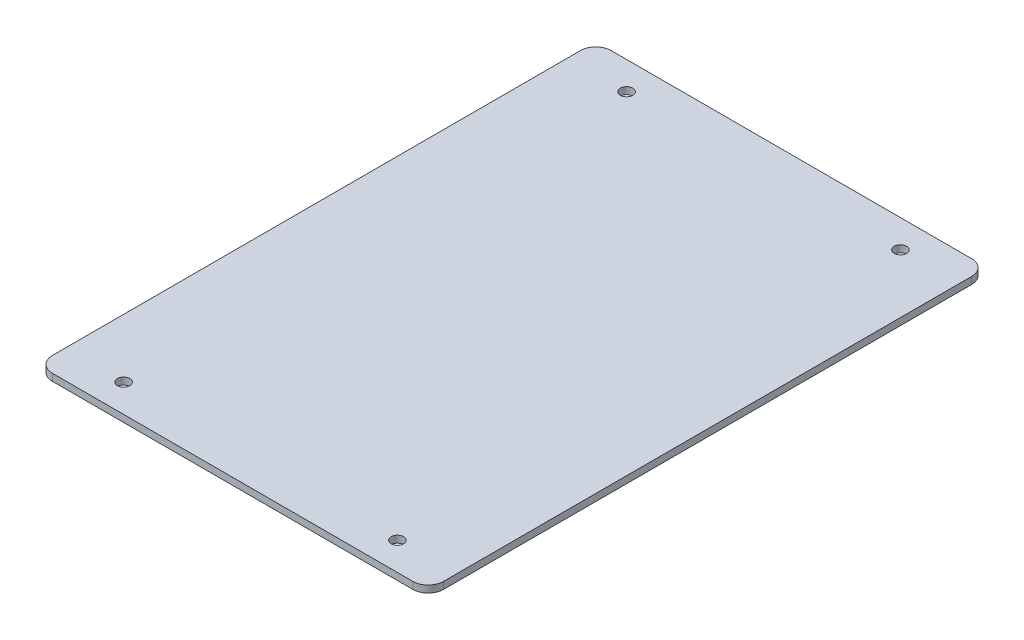
ISO-10303-21;
HEADER;
FILE_DESCRIPTION(('STEP AP214'),'2;1');
FILE_NAME('part.step','',(''),(''),'','','');
FILE_SCHEMA(('AUTOMOTIVE_DESIGN { 1 0 10303 214 1 1 1 1 }'));
ENDSEC;
DATA;
#1=APPLICATION_CONTEXT('core data for automotive mechanical design processes');
#2=APPLICATION_PROTOCOL_DEFINITION('international standard','automotive_design',2000,#1);
#3=PRODUCT_CONTEXT('',#1,'mechanical');
#4=PRODUCT('Part','Part','',(#3));
#5=PRODUCT_RELATED_PRODUCT_CATEGORY('part','',(#4));
#6=PRODUCT_DEFINITION_FORMATION('','',#4);
#7=PRODUCT_DEFINITION_CONTEXT('part definition',#1,'design');
#8=PRODUCT_DEFINITION('design','',#6,#7);
#9=PRODUCT_DEFINITION_SHAPE('','',#8);
#10=(LENGTH_UNIT() NAMED_UNIT(*) SI_UNIT(.MILLI.,.METRE.));
#11=(NAMED_UNIT(*) PLANE_ANGLE_UNIT() SI_UNIT($,.RADIAN.));
#12=(NAMED_UNIT(*) SI_UNIT($,.STERADIAN.) SOLID_ANGLE_UNIT());
#13=UNCERTAINTY_MEASURE_WITH_UNIT(LENGTH_MEASURE(1.E-05),#10,'distance_accuracy_value','');
#14=(GEOMETRIC_REPRESENTATION_CONTEXT(3) GLOBAL_UNCERTAINTY_ASSIGNED_CONTEXT((#13)) GLOBAL_UNIT_ASSIGNED_CONTEXT((#10,
#11,#12)) REPRESENTATION_CONTEXT('',''));
#15=CARTESIAN_POINT('',(0.,0.,0.));
#16=DIRECTION('',(0.,0.,1.));
#17=DIRECTION('',(1.,0.,0.));
#18=AXIS2_PLACEMENT_3D('',#15,#16,#17);
#19=CARTESIAN_POINT('',(35.56,1.27,50.8));
#20=DIRECTION('',(-1.,0.,0.));
#21=DIRECTION('',(0.,0.,1.));
#22=AXIS2_PLACEMENT_3D('',#19,#20,#21);
#23=PLANE('',#22);
#24=DIRECTION('',(0.,0.,-1.));
#25=VECTOR('',#24,1.);
#26=CARTESIAN_POINT('',(35.56,0.,50.8));
#27=LINE('',#26,#25);
#28=CARTESIAN_POINT('',(35.56,0.,48.006));
#29=VERTEX_POINT('',#28);
#30=CARTESIAN_POINT('',(35.56,0.,-48.006));
#31=VERTEX_POINT('',#30);
#32=EDGE_CURVE('E152',#29,#31,#27,.T.);
#33=ORIENTED_EDGE('',*,*,#32,.T.);
#34=DIRECTION('',(0.,-1.,0.));
#35=VECTOR('',#34,1.);
#36=CARTESIAN_POINT('',(35.56,1.27,-48.006));
#37=LINE('',#36,#35);
#38=CARTESIAN_POINT('',(35.56,1.27,-48.006));
#39=VERTEX_POINT('',#38);
#40=EDGE_CURVE('E127',#31,#39,#37,.F.);
#41=ORIENTED_EDGE('',*,*,#40,.T.);
#42=DIRECTION('',(0.,0.,-1.));
#43=VECTOR('',#42,1.);
#44=CARTESIAN_POINT('',(35.56,1.27,50.8));
#45=LINE('',#44,#43);
#46=CARTESIAN_POINT('',(35.56,1.27,48.006));
#47=VERTEX_POINT('',#46);
#48=EDGE_CURVE('E165',#47,#39,#45,.T.);
#49=ORIENTED_EDGE('',*,*,#48,.F.);
#50=DIRECTION('',(0.,-1.,0.));
#51=VECTOR('',#50,1.);
#52=CARTESIAN_POINT('',(35.56,1.27,48.006));
#53=LINE('',#52,#51);
#54=EDGE_CURVE('E133',#47,#29,#53,.T.);
#55=ORIENTED_EDGE('',*,*,#54,.T.);
#56=EDGE_LOOP('',(#33,#41,#49,#55));
#57=FACE_BOUND('',#56,.T.);
#58=ADVANCED_FACE('F53',(#57),#23,.F.);
#59=CARTESIAN_POINT('',(-35.56,1.27,-50.8));
#60=DIRECTION('',(0.,0.,1.));
#61=DIRECTION('',(1.,0.,0.));
#62=AXIS2_PLACEMENT_3D('',#59,#60,#61);
#63=PLANE('',#62);
#64=DIRECTION('',(-1.,0.,0.));
#65=VECTOR('',#64,1.);
#66=CARTESIAN_POINT('',(-35.56,1.27,-50.8));
#67=LINE('',#66,#65);
#68=CARTESIAN_POINT('',(32.766,1.27,-50.8));
#69=VERTEX_POINT('',#68);
#70=CARTESIAN_POINT('',(-32.766,1.27,-50.8));
#71=VERTEX_POINT('',#70);
#72=EDGE_CURVE('E143',#69,#71,#67,.T.);
#73=ORIENTED_EDGE('',*,*,#72,.F.);
#74=DIRECTION('',(0.,-1.,0.));
#75=VECTOR('',#74,1.);
#76=CARTESIAN_POINT('',(32.766,1.27,-50.8));
#77=LINE('',#76,#75);
#78=CARTESIAN_POINT('',(32.766,0.,-50.8));
#79=VERTEX_POINT('',#78);
#80=EDGE_CURVE('E126',#69,#79,#77,.T.);
#81=ORIENTED_EDGE('',*,*,#80,.T.);
#82=DIRECTION('',(-1.,0.,0.));
#83=VECTOR('',#82,1.);
#84=CARTESIAN_POINT('',(-35.56,0.,-50.8));
#85=LINE('',#84,#83);
#86=CARTESIAN_POINT('',(-32.766,0.,-50.8));
#87=VERTEX_POINT('',#86);
#88=EDGE_CURVE('E140',#79,#87,#85,.T.);
#89=ORIENTED_EDGE('',*,*,#88,.T.);
#90=DIRECTION('',(0.,-1.,0.));
#91=VECTOR('',#90,1.);
#92=CARTESIAN_POINT('',(-32.766,1.27,-50.8));
#93=LINE('',#92,#91);
#94=EDGE_CURVE('E146',#87,#71,#93,.F.);
#95=ORIENTED_EDGE('',*,*,#94,.T.);
#96=EDGE_LOOP('',(#73,#81,#89,#95));
#97=FACE_BOUND('',#96,.T.);
#98=ADVANCED_FACE('F139',(#97),#63,.F.);
#99=CARTESIAN_POINT('',(-35.56,1.27,50.8));
#100=DIRECTION('',(1.,0.,0.));
#101=DIRECTION('',(0.,0.,-1.));
#102=AXIS2_PLACEMENT_3D('',#99,#100,#101);
#103=PLANE('',#102);
#104=DIRECTION('',(0.,0.,1.));
#105=VECTOR('',#104,1.);
#106=CARTESIAN_POINT('',(-35.56,1.27,50.8));
#107=LINE('',#106,#105);
#108=CARTESIAN_POINT('',(-35.56,1.27,-48.006));
#109=VERTEX_POINT('',#108);
#110=CARTESIAN_POINT('',(-35.56,1.27,48.006));
#111=VERTEX_POINT('',#110);
#112=EDGE_CURVE('E236',#109,#111,#107,.T.);
#113=ORIENTED_EDGE('',*,*,#112,.F.);
#114=DIRECTION('',(0.,-1.,0.));
#115=VECTOR('',#114,1.);
#116=CARTESIAN_POINT('',(-35.56,1.27,-48.006));
#117=LINE('',#116,#115);
#118=CARTESIAN_POINT('',(-35.56,0.,-48.006));
#119=VERTEX_POINT('',#118);
#120=EDGE_CURVE('E195',#109,#119,#117,.T.);
#121=ORIENTED_EDGE('',*,*,#120,.T.);
#122=DIRECTION('',(0.,0.,1.));
#123=VECTOR('',#122,1.);
#124=CARTESIAN_POINT('',(-35.56,0.,50.8));
#125=LINE('',#124,#123);
#126=CARTESIAN_POINT('',(-35.56,0.,48.006));
#127=VERTEX_POINT('',#126);
#128=EDGE_CURVE('E151',#119,#127,#125,.T.);
#129=ORIENTED_EDGE('',*,*,#128,.T.);
#130=DIRECTION('',(0.,-1.,0.));
#131=VECTOR('',#130,1.);
#132=CARTESIAN_POINT('',(-35.56,1.27,48.006));
#133=LINE('',#132,#131);
#134=EDGE_CURVE('E192',#127,#111,#133,.F.);
#135=ORIENTED_EDGE('',*,*,#134,.T.);
#136=EDGE_LOOP('',(#113,#121,#129,#135));
#137=FACE_BOUND('',#136,.T.);
#138=ADVANCED_FACE('F253',(#137),#103,.F.);
#139=CARTESIAN_POINT('',(-35.56,1.27,50.8));
#140=DIRECTION('',(0.,0.,-1.));
#141=DIRECTION('',(-1.,0.,0.));
#142=AXIS2_PLACEMENT_3D('',#139,#140,#141);
#143=PLANE('',#142);
#144=DIRECTION('',(1.,0.,0.));
#145=VECTOR('',#144,1.);
#146=CARTESIAN_POINT('',(-35.56,1.27,50.8));
#147=LINE('',#146,#145);
#148=CARTESIAN_POINT('',(-32.766,1.27,50.8));
#149=VERTEX_POINT('',#148);
#150=CARTESIAN_POINT('',(32.766,1.27,50.8));
#151=VERTEX_POINT('',#150);
#152=EDGE_CURVE('E167',#149,#151,#147,.T.);
#153=ORIENTED_EDGE('',*,*,#152,.F.);
#154=DIRECTION('',(0.,-1.,0.));
#155=VECTOR('',#154,1.);
#156=CARTESIAN_POINT('',(-32.766,1.27,50.8));
#157=LINE('',#156,#155);
#158=CARTESIAN_POINT('',(-32.766,0.,50.8));
#159=VERTEX_POINT('',#158);
#160=EDGE_CURVE('E11',#149,#159,#157,.T.);
#161=ORIENTED_EDGE('',*,*,#160,.T.);
#162=DIRECTION('',(1.,0.,0.));
#163=VECTOR('',#162,1.);
#164=CARTESIAN_POINT('',(-35.56,0.,50.8));
#165=LINE('',#164,#163);
#166=CARTESIAN_POINT('',(32.766,0.,50.8));
#167=VERTEX_POINT('',#166);
#168=EDGE_CURVE('E157',#159,#167,#165,.T.);
#169=ORIENTED_EDGE('',*,*,#168,.T.);
#170=DIRECTION('',(0.,-1.,0.));
#171=VECTOR('',#170,1.);
#172=CARTESIAN_POINT('',(32.766,1.27,50.8));
#173=LINE('',#172,#171);
#174=EDGE_CURVE('E63',#167,#151,#173,.F.);
#175=ORIENTED_EDGE('',*,*,#174,.T.);
#176=EDGE_LOOP('',(#153,#161,#169,#175));
#177=FACE_BOUND('',#176,.T.);
#178=ADVANCED_FACE('F247',(#177),#143,.F.);
#179=CARTESIAN_POINT('',(0.,1.27,0.));
#180=DIRECTION('',(0.,-1.,0.));
#181=DIRECTION('',(0.,0.,-1.));
#182=AXIS2_PLACEMENT_3D('',#179,#180,#181);
#183=PLANE('',#182);
#184=CARTESIAN_POINT('',(-24.892,1.27,-45.72));
#185=DIRECTION('',(0.,1.,0.));
#186=DIRECTION('',(0.,0.,1.));
#187=AXIS2_PLACEMENT_3D('',#184,#185,#186);
#188=CIRCLE('',#187,1.13029999999999);
#189=CARTESIAN_POINT('',(-24.892,1.27,-44.5897));
#190=VERTEX_POINT('',#189);
#191=EDGE_CURVE('E225',#190,#190,#188,.T.);
#192=ORIENTED_EDGE('',*,*,#191,.F.);
#193=EDGE_LOOP('',(#192));
#194=FACE_BOUND('',#193,.T.);
#195=CARTESIAN_POINT('',(24.892,1.27,-45.72));
#196=DIRECTION('',(0.,1.,0.));
#197=DIRECTION('',(0.,0.,1.));
#198=AXIS2_PLACEMENT_3D('',#195,#196,#197);
#199=CIRCLE('',#198,1.13029999999999);
#200=CARTESIAN_POINT('',(24.892,1.27,-44.5897));
#201=VERTEX_POINT('',#200);
#202=EDGE_CURVE('E212',#201,#201,#199,.T.);
#203=ORIENTED_EDGE('',*,*,#202,.F.);
#204=EDGE_LOOP('',(#203));
#205=FACE_BOUND('',#204,.T.);
#206=CARTESIAN_POINT('',(-24.892,1.27,45.72));
#207=DIRECTION('',(0.,1.,0.));
#208=DIRECTION('',(0.,0.,1.));
#209=AXIS2_PLACEMENT_3D('',#206,#207,#208);
#210=CIRCLE('',#209,1.13029999999999);
#211=CARTESIAN_POINT('',(-24.892,1.27,46.8503));
#212=VERTEX_POINT('',#211);
#213=EDGE_CURVE('E208',#212,#212,#210,.T.);
#214=ORIENTED_EDGE('',*,*,#213,.F.);
#215=EDGE_LOOP('',(#214));
#216=FACE_BOUND('',#215,.T.);
#217=CARTESIAN_POINT('',(24.892,1.27,45.72));
#218=DIRECTION('',(0.,1.,0.));
#219=DIRECTION('',(0.,0.,1.));
#220=AXIS2_PLACEMENT_3D('',#217,#218,#219);
#221=CIRCLE('',#220,1.13029999999999);
#222=CARTESIAN_POINT('',(24.892,1.27,46.8503));
#223=VERTEX_POINT('',#222);
#224=EDGE_CURVE('E204',#223,#223,#221,.T.);
#225=ORIENTED_EDGE('',*,*,#224,.F.);
#226=EDGE_LOOP('',(#225));
#227=FACE_BOUND('',#226,.T.);
#228=ORIENTED_EDGE('',*,*,#48,.T.);
#229=CARTESIAN_POINT('',(32.766,1.27,-48.006));
#230=DIRECTION('',(0.,-1.,0.));
#231=DIRECTION('',(0.,0.,-1.));
#232=AXIS2_PLACEMENT_3D('',#229,#230,#231);
#233=CIRCLE('',#232,2.794);
#234=EDGE_CURVE('E189',#39,#69,#233,.F.);
#235=ORIENTED_EDGE('',*,*,#234,.T.);
#236=ORIENTED_EDGE('',*,*,#72,.T.);
#237=CARTESIAN_POINT('',(-32.766,1.27,-48.006));
#238=DIRECTION('',(0.,-1.,0.));
#239=DIRECTION('',(0.,0.,-1.));
#240=AXIS2_PLACEMENT_3D('',#237,#238,#239);
#241=CIRCLE('',#240,2.794);
#242=EDGE_CURVE('E186',#71,#109,#241,.F.);
#243=ORIENTED_EDGE('',*,*,#242,.T.);
#244=ORIENTED_EDGE('',*,*,#112,.T.);
#245=CARTESIAN_POINT('',(-32.766,1.27,48.006));
#246=DIRECTION('',(0.,-1.,0.));
#247=DIRECTION('',(0.,0.,-1.));
#248=AXIS2_PLACEMENT_3D('',#245,#246,#247);
#249=CIRCLE('',#248,2.794);
#250=EDGE_CURVE('E77',#111,#149,#249,.F.);
#251=ORIENTED_EDGE('',*,*,#250,.T.);
#252=ORIENTED_EDGE('',*,*,#152,.T.);
#253=CARTESIAN_POINT('',(32.766,1.27,48.006));
#254=DIRECTION('',(0.,-1.,0.));
#255=DIRECTION('',(0.,0.,-1.));
#256=AXIS2_PLACEMENT_3D('',#253,#254,#255);
#257=CIRCLE('',#256,2.794);
#258=EDGE_CURVE('E181',#151,#47,#257,.F.);
#259=ORIENTED_EDGE('',*,*,#258,.T.);
#260=EDGE_LOOP('',(#228,#235,#236,#243,#244,#251,#252,#259));
#261=FACE_BOUND('',#260,.T.);
#262=ADVANCED_FACE('F240',(#194,#205,#216,#227,#261),#183,.F.);
#263=CARTESIAN_POINT('',(0.,0.,0.));
#264=DIRECTION('',(0.,-1.,0.));
#265=DIRECTION('',(0.,0.,-1.));
#266=AXIS2_PLACEMENT_3D('',#263,#264,#265);
#267=PLANE('',#266);
#268=CARTESIAN_POINT('',(-24.892,0.,-45.72));
#269=DIRECTION('',(0.,-1.,0.));
#270=DIRECTION('',(0.,0.,-1.));
#271=AXIS2_PLACEMENT_3D('',#268,#269,#270);
#272=CIRCLE('',#271,1.13029999999999);
#273=CARTESIAN_POINT('',(-24.892,0.,-46.8503));
#274=VERTEX_POINT('',#273);
#275=EDGE_CURVE('E57',#274,#274,#272,.T.);
#276=ORIENTED_EDGE('',*,*,#275,.F.);
#277=EDGE_LOOP('',(#276));
#278=FACE_BOUND('',#277,.T.);
#279=CARTESIAN_POINT('',(24.892,0.,-45.72));
#280=DIRECTION('',(0.,-1.,0.));
#281=DIRECTION('',(0.,0.,-1.));
#282=AXIS2_PLACEMENT_3D('',#279,#280,#281);
#283=CIRCLE('',#282,1.13029999999999);
#284=CARTESIAN_POINT('',(24.892,0.,-46.8503));
#285=VERTEX_POINT('',#284);
#286=EDGE_CURVE('E209',#285,#285,#283,.T.);
#287=ORIENTED_EDGE('',*,*,#286,.F.);
#288=EDGE_LOOP('',(#287));
#289=FACE_BOUND('',#288,.T.);
#290=CARTESIAN_POINT('',(-24.892,0.,45.72));
#291=DIRECTION('',(0.,-1.,0.));
#292=DIRECTION('',(0.,0.,-1.));
#293=AXIS2_PLACEMENT_3D('',#290,#291,#292);
#294=CIRCLE('',#293,1.13029999999999);
#295=CARTESIAN_POINT('',(-24.892,0.,44.5897));
#296=VERTEX_POINT('',#295);
#297=EDGE_CURVE('E205',#296,#296,#294,.T.);
#298=ORIENTED_EDGE('',*,*,#297,.F.);
#299=EDGE_LOOP('',(#298));
#300=FACE_BOUND('',#299,.T.);
#301=CARTESIAN_POINT('',(24.892,0.,45.72));
#302=DIRECTION('',(0.,-1.,0.));
#303=DIRECTION('',(0.,0.,-1.));
#304=AXIS2_PLACEMENT_3D('',#301,#302,#303);
#305=CIRCLE('',#304,1.13029999999999);
#306=CARTESIAN_POINT('',(24.892,0.,44.5897));
#307=VERTEX_POINT('',#306);
#308=EDGE_CURVE('E159',#307,#307,#305,.T.);
#309=ORIENTED_EDGE('',*,*,#308,.F.);
#310=EDGE_LOOP('',(#309));
#311=FACE_BOUND('',#310,.T.);
#312=ORIENTED_EDGE('',*,*,#88,.F.);
#313=CARTESIAN_POINT('',(32.766,0.,-48.006));
#314=DIRECTION('',(0.,-1.,0.));
#315=DIRECTION('',(0.,0.,-1.));
#316=AXIS2_PLACEMENT_3D('',#313,#314,#315);
#317=CIRCLE('',#316,2.794);
#318=EDGE_CURVE('E122',#79,#31,#317,.T.);
#319=ORIENTED_EDGE('',*,*,#318,.T.);
#320=ORIENTED_EDGE('',*,*,#32,.F.);
#321=CARTESIAN_POINT('',(32.766,0.,48.006));
#322=DIRECTION('',(0.,-1.,0.));
#323=DIRECTION('',(0.,0.,-1.));
#324=AXIS2_PLACEMENT_3D('',#321,#322,#323);
#325=CIRCLE('',#324,2.794);
#326=EDGE_CURVE('E145',#29,#167,#325,.T.);
#327=ORIENTED_EDGE('',*,*,#326,.T.);
#328=ORIENTED_EDGE('',*,*,#168,.F.);
#329=CARTESIAN_POINT('',(-32.766,0.,48.006));
#330=DIRECTION('',(0.,-1.,0.));
#331=DIRECTION('',(0.,0.,-1.));
#332=AXIS2_PLACEMENT_3D('',#329,#330,#331);
#333=CIRCLE('',#332,2.794);
#334=EDGE_CURVE('E171',#159,#127,#333,.T.);
#335=ORIENTED_EDGE('',*,*,#334,.T.);
#336=ORIENTED_EDGE('',*,*,#128,.F.);
#337=CARTESIAN_POINT('',(-32.766,0.,-48.006));
#338=DIRECTION('',(0.,-1.,0.));
#339=DIRECTION('',(0.,0.,-1.));
#340=AXIS2_PLACEMENT_3D('',#337,#338,#339);
#341=CIRCLE('',#340,2.794);
#342=EDGE_CURVE('E134',#119,#87,#341,.T.);
#343=ORIENTED_EDGE('',*,*,#342,.T.);
#344=EDGE_LOOP('',(#312,#319,#320,#327,#328,#335,#336,#343));
#345=FACE_BOUND('',#344,.T.);
#346=ADVANCED_FACE('F148',(#278,#289,#300,#311,#345),#267,.T.);
#347=CARTESIAN_POINT('',(32.766,1.27,-48.006));
#348=DIRECTION('',(0.,-1.,0.));
#349=DIRECTION('',(0.,0.,-1.));
#350=AXIS2_PLACEMENT_3D('',#347,#348,#349);
#351=CYLINDRICAL_SURFACE('',#350,2.794);
#352=ORIENTED_EDGE('',*,*,#234,.F.);
#353=ORIENTED_EDGE('',*,*,#40,.F.);
#354=ORIENTED_EDGE('',*,*,#318,.F.);
#355=ORIENTED_EDGE('',*,*,#80,.F.);
#356=EDGE_LOOP('',(#352,#353,#354,#355));
#357=FACE_BOUND('',#356,.T.);
#358=ADVANCED_FACE('F125',(#357),#351,.T.);
#359=CARTESIAN_POINT('',(-32.766,1.27,-48.006));
#360=DIRECTION('',(0.,-1.,0.));
#361=DIRECTION('',(0.,0.,-1.));
#362=AXIS2_PLACEMENT_3D('',#359,#360,#361);
#363=CYLINDRICAL_SURFACE('',#362,2.794);
#364=ORIENTED_EDGE('',*,*,#242,.F.);
#365=ORIENTED_EDGE('',*,*,#94,.F.);
#366=ORIENTED_EDGE('',*,*,#342,.F.);
#367=ORIENTED_EDGE('',*,*,#120,.F.);
#368=EDGE_LOOP('',(#364,#365,#366,#367));
#369=FACE_BOUND('',#368,.T.);
#370=ADVANCED_FACE('F257',(#369),#363,.T.);
#371=CARTESIAN_POINT('',(-32.766,1.27,48.006));
#372=DIRECTION('',(0.,-1.,0.));
#373=DIRECTION('',(0.,0.,-1.));
#374=AXIS2_PLACEMENT_3D('',#371,#372,#373);
#375=CYLINDRICAL_SURFACE('',#374,2.794);
#376=ORIENTED_EDGE('',*,*,#250,.F.);
#377=ORIENTED_EDGE('',*,*,#134,.F.);
#378=ORIENTED_EDGE('',*,*,#334,.F.);
#379=ORIENTED_EDGE('',*,*,#160,.F.);
#380=EDGE_LOOP('',(#376,#377,#378,#379));
#381=FACE_BOUND('',#380,.T.);
#382=ADVANCED_FACE('F249',(#381),#375,.T.);
#383=CARTESIAN_POINT('',(32.766,1.27,48.006));
#384=DIRECTION('',(0.,-1.,0.));
#385=DIRECTION('',(0.,0.,-1.));
#386=AXIS2_PLACEMENT_3D('',#383,#384,#385);
#387=CYLINDRICAL_SURFACE('',#386,2.794);
#388=ORIENTED_EDGE('',*,*,#258,.F.);
#389=ORIENTED_EDGE('',*,*,#174,.F.);
#390=ORIENTED_EDGE('',*,*,#326,.F.);
#391=ORIENTED_EDGE('',*,*,#54,.F.);
#392=EDGE_LOOP('',(#388,#389,#390,#391));
#393=FACE_BOUND('',#392,.T.);
#394=ADVANCED_FACE('F55',(#393),#387,.T.);
#395=CARTESIAN_POINT('',(24.892,1.27,45.72));
#396=DIRECTION('',(0.,1.,0.));
#397=DIRECTION('',(0.,0.,1.));
#398=AXIS2_PLACEMENT_3D('',#395,#396,#397);
#399=CYLINDRICAL_SURFACE('',#398,1.13029999999999);
#400=ORIENTED_EDGE('',*,*,#308,.T.);
#401=EDGE_LOOP('',(#400));
#402=FACE_BOUND('',#401,.T.);
#403=ORIENTED_EDGE('',*,*,#224,.T.);
#404=EDGE_LOOP('',(#403));
#405=FACE_BOUND('',#404,.T.);
#406=ADVANCED_FACE('F282',(#402,#405),#399,.F.);
#407=CARTESIAN_POINT('',(-24.892,1.27,45.72));
#408=DIRECTION('',(0.,1.,0.));
#409=DIRECTION('',(0.,0.,1.));
#410=AXIS2_PLACEMENT_3D('',#407,#408,#409);
#411=CYLINDRICAL_SURFACE('',#410,1.13029999999999);
#412=ORIENTED_EDGE('',*,*,#297,.T.);
#413=EDGE_LOOP('',(#412));
#414=FACE_BOUND('',#413,.T.);
#415=ORIENTED_EDGE('',*,*,#213,.T.);
#416=EDGE_LOOP('',(#415));
#417=FACE_BOUND('',#416,.T.);
#418=ADVANCED_FACE('F285',(#414,#417),#411,.F.);
#419=CARTESIAN_POINT('',(24.892,1.27,-45.72));
#420=DIRECTION('',(0.,1.,0.));
#421=DIRECTION('',(0.,0.,1.));
#422=AXIS2_PLACEMENT_3D('',#419,#420,#421);
#423=CYLINDRICAL_SURFACE('',#422,1.13029999999999);
#424=ORIENTED_EDGE('',*,*,#286,.T.);
#425=EDGE_LOOP('',(#424));
#426=FACE_BOUND('',#425,.T.);
#427=ORIENTED_EDGE('',*,*,#202,.T.);
#428=EDGE_LOOP('',(#427));
#429=FACE_BOUND('',#428,.T.);
#430=ADVANCED_FACE('F289',(#426,#429),#423,.F.);
#431=CARTESIAN_POINT('',(-24.892,1.27,-45.72));
#432=DIRECTION('',(0.,1.,0.));
#433=DIRECTION('',(0.,0.,1.));
#434=AXIS2_PLACEMENT_3D('',#431,#432,#433);
#435=CYLINDRICAL_SURFACE('',#434,1.13029999999999);
#436=ORIENTED_EDGE('',*,*,#275,.T.);
#437=EDGE_LOOP('',(#436));
#438=FACE_BOUND('',#437,.T.);
#439=ORIENTED_EDGE('',*,*,#191,.T.);
#440=EDGE_LOOP('',(#439));
#441=FACE_BOUND('',#440,.T.);
#442=ADVANCED_FACE('F293',(#438,#441),#435,.F.);
#443=CLOSED_SHELL('',(#58,#98,#138,#178,#262,#346,#358,#370,#382,#394,#406,#418,#430,#442));
#444=MANIFOLD_SOLID_BREP('B2',#443);
#445=ADVANCED_BREP_SHAPE_REPRESENTATION('',(#18,#444),#14);
#446=SHAPE_DEFINITION_REPRESENTATION(#9,#445);
ENDSEC;
END-ISO-10303-21;
